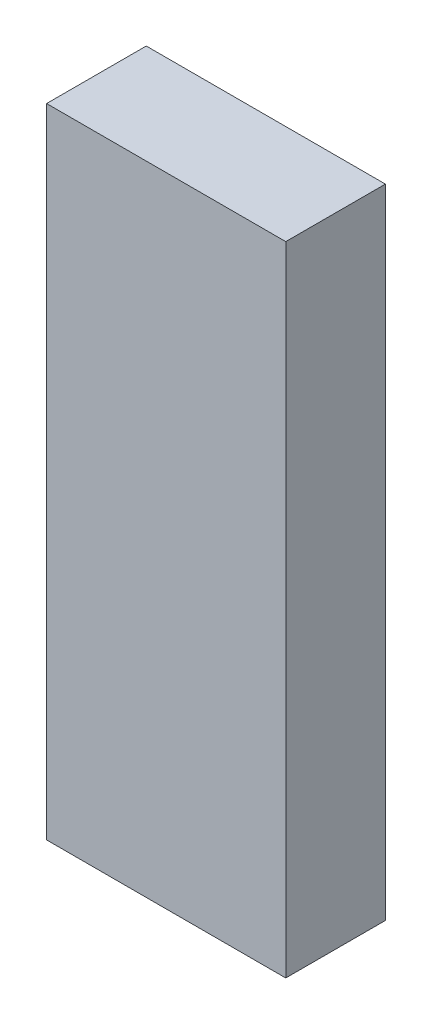
ISO-10303-21;
HEADER;
FILE_DESCRIPTION(('STEP AP214'),'2;1');
FILE_NAME('part.step','',(''),(''),'','','');
FILE_SCHEMA(('AUTOMOTIVE_DESIGN { 1 0 10303 214 1 1 1 1 }'));
ENDSEC;
DATA;
#1=APPLICATION_CONTEXT('core data for automotive mechanical design processes');
#2=APPLICATION_PROTOCOL_DEFINITION('international standard','automotive_design',2000,#1);
#3=PRODUCT_CONTEXT('',#1,'mechanical');
#4=PRODUCT('Part','Part','',(#3));
#5=PRODUCT_RELATED_PRODUCT_CATEGORY('part','',(#4));
#6=PRODUCT_DEFINITION_FORMATION('','',#4);
#7=PRODUCT_DEFINITION_CONTEXT('part definition',#1,'design');
#8=PRODUCT_DEFINITION('design','',#6,#7);
#9=PRODUCT_DEFINITION_SHAPE('','',#8);
#10=(LENGTH_UNIT() NAMED_UNIT(*) SI_UNIT(.MILLI.,.METRE.));
#11=(NAMED_UNIT(*) PLANE_ANGLE_UNIT() SI_UNIT($,.RADIAN.));
#12=(NAMED_UNIT(*) SI_UNIT($,.STERADIAN.) SOLID_ANGLE_UNIT());
#13=UNCERTAINTY_MEASURE_WITH_UNIT(LENGTH_MEASURE(1.E-05),#10,'distance_accuracy_value','');
#14=(GEOMETRIC_REPRESENTATION_CONTEXT(3) GLOBAL_UNCERTAINTY_ASSIGNED_CONTEXT((#13)) GLOBAL_UNIT_ASSIGNED_CONTEXT((#10,
#11,#12)) REPRESENTATION_CONTEXT('',''));
#15=CARTESIAN_POINT('',(0.,0.,0.));
#16=DIRECTION('',(0.,0.,1.));
#17=DIRECTION('',(1.,0.,0.));
#18=AXIS2_PLACEMENT_3D('',#15,#16,#17);
#19=CARTESIAN_POINT('',(9.525,25.4,7.9375));
#20=DIRECTION('',(-1.,0.,0.));
#21=DIRECTION('',(0.,-1.,0.));
#22=AXIS2_PLACEMENT_3D('',#19,#20,#21);
#23=PLANE('',#22);
#24=DIRECTION('',(0.,1.,0.));
#25=VECTOR('',#24,1.);
#26=CARTESIAN_POINT('',(9.525,25.4,0.));
#27=LINE('',#26,#25);
#28=CARTESIAN_POINT('',(9.525,-25.4,0.));
#29=VERTEX_POINT('',#28);
#30=CARTESIAN_POINT('',(9.525,25.4,0.));
#31=VERTEX_POINT('',#30);
#32=EDGE_CURVE('E113',#29,#31,#27,.T.);
#33=ORIENTED_EDGE('',*,*,#32,.T.);
#34=DIRECTION('',(0.,0.,-1.));
#35=VECTOR('',#34,1.);
#36=CARTESIAN_POINT('',(9.525,25.4,7.9375));
#37=LINE('',#36,#35);
#38=CARTESIAN_POINT('',(9.525,25.4,7.9375));
#39=VERTEX_POINT('',#38);
#40=EDGE_CURVE('E11',#39,#31,#37,.T.);
#41=ORIENTED_EDGE('',*,*,#40,.F.);
#42=DIRECTION('',(0.,1.,0.));
#43=VECTOR('',#42,1.);
#44=CARTESIAN_POINT('',(9.525,25.4,7.9375));
#45=LINE('',#44,#43);
#46=CARTESIAN_POINT('',(9.525,-25.4,7.9375));
#47=VERTEX_POINT('',#46);
#48=EDGE_CURVE('E97',#47,#39,#45,.T.);
#49=ORIENTED_EDGE('',*,*,#48,.F.);
#50=DIRECTION('',(0.,0.,-1.));
#51=VECTOR('',#50,1.);
#52=CARTESIAN_POINT('',(9.525,-25.4,7.9375));
#53=LINE('',#52,#51);
#54=EDGE_CURVE('E109',#47,#29,#53,.T.);
#55=ORIENTED_EDGE('',*,*,#54,.T.);
#56=EDGE_LOOP('',(#33,#41,#49,#55));
#57=FACE_BOUND('',#56,.T.);
#58=ADVANCED_FACE('F45',(#57),#23,.F.);
#59=CARTESIAN_POINT('',(-9.525,25.4,7.9375));
#60=DIRECTION('',(0.,-1.,0.));
#61=DIRECTION('',(0.,0.,-1.));
#62=AXIS2_PLACEMENT_3D('',#59,#60,#61);
#63=PLANE('',#62);
#64=DIRECTION('',(-1.,0.,0.));
#65=VECTOR('',#64,1.);
#66=CARTESIAN_POINT('',(-9.525,25.4,0.));
#67=LINE('',#66,#65);
#68=CARTESIAN_POINT('',(-9.525,25.4,0.));
#69=VERTEX_POINT('',#68);
#70=EDGE_CURVE('E102',#31,#69,#67,.T.);
#71=ORIENTED_EDGE('',*,*,#70,.T.);
#72=DIRECTION('',(0.,0.,-1.));
#73=VECTOR('',#72,1.);
#74=CARTESIAN_POINT('',(-9.525,25.4,7.9375));
#75=LINE('',#74,#73);
#76=CARTESIAN_POINT('',(-9.525,25.4,7.9375));
#77=VERTEX_POINT('',#76);
#78=EDGE_CURVE('E54',#77,#69,#75,.T.);
#79=ORIENTED_EDGE('',*,*,#78,.F.);
#80=DIRECTION('',(-1.,0.,0.));
#81=VECTOR('',#80,1.);
#82=CARTESIAN_POINT('',(-9.525,25.4,7.9375));
#83=LINE('',#82,#81);
#84=EDGE_CURVE('E92',#39,#77,#83,.T.);
#85=ORIENTED_EDGE('',*,*,#84,.F.);
#86=ORIENTED_EDGE('',*,*,#40,.T.);
#87=EDGE_LOOP('',(#71,#79,#85,#86));
#88=FACE_BOUND('',#87,.T.);
#89=ADVANCED_FACE('F101',(#88),#63,.F.);
#90=CARTESIAN_POINT('',(-9.525,25.4,7.9375));
#91=DIRECTION('',(1.,0.,0.));
#92=DIRECTION('',(0.,1.,0.));
#93=AXIS2_PLACEMENT_3D('',#90,#91,#92);
#94=PLANE('',#93);
#95=DIRECTION('',(0.,-1.,0.));
#96=VECTOR('',#95,1.);
#97=CARTESIAN_POINT('',(-9.525,25.4,0.));
#98=LINE('',#97,#96);
#99=CARTESIAN_POINT('',(-9.525,-25.4,0.));
#100=VERTEX_POINT('',#99);
#101=EDGE_CURVE('E79',#69,#100,#98,.T.);
#102=ORIENTED_EDGE('',*,*,#101,.T.);
#103=DIRECTION('',(0.,0.,-1.));
#104=VECTOR('',#103,1.);
#105=CARTESIAN_POINT('',(-9.525,-25.4,7.9375));
#106=LINE('',#105,#104);
#107=CARTESIAN_POINT('',(-9.525,-25.4,7.9375));
#108=VERTEX_POINT('',#107);
#109=EDGE_CURVE('E104',#108,#100,#106,.T.);
#110=ORIENTED_EDGE('',*,*,#109,.F.);
#111=DIRECTION('',(0.,-1.,0.));
#112=VECTOR('',#111,1.);
#113=CARTESIAN_POINT('',(-9.525,25.4,7.9375));
#114=LINE('',#113,#112);
#115=EDGE_CURVE('E95',#77,#108,#114,.T.);
#116=ORIENTED_EDGE('',*,*,#115,.F.);
#117=ORIENTED_EDGE('',*,*,#78,.T.);
#118=EDGE_LOOP('',(#102,#110,#116,#117));
#119=FACE_BOUND('',#118,.T.);
#120=ADVANCED_FACE('F105',(#119),#94,.F.);
#121=CARTESIAN_POINT('',(-9.525,-25.4,7.9375));
#122=DIRECTION('',(0.,1.,0.));
#123=DIRECTION('',(0.,0.,1.));
#124=AXIS2_PLACEMENT_3D('',#121,#122,#123);
#125=PLANE('',#124);
#126=DIRECTION('',(1.,0.,0.));
#127=VECTOR('',#126,1.);
#128=CARTESIAN_POINT('',(-9.525,-25.4,0.));
#129=LINE('',#128,#127);
#130=EDGE_CURVE('E85',#100,#29,#129,.T.);
#131=ORIENTED_EDGE('',*,*,#130,.T.);
#132=ORIENTED_EDGE('',*,*,#54,.F.);
#133=DIRECTION('',(1.,0.,0.));
#134=VECTOR('',#133,1.);
#135=CARTESIAN_POINT('',(-9.525,-25.4,7.9375));
#136=LINE('',#135,#134);
#137=EDGE_CURVE('E62',#108,#47,#136,.T.);
#138=ORIENTED_EDGE('',*,*,#137,.F.);
#139=ORIENTED_EDGE('',*,*,#109,.T.);
#140=EDGE_LOOP('',(#131,#132,#138,#139));
#141=FACE_BOUND('',#140,.T.);
#142=ADVANCED_FACE('F126',(#141),#125,.F.);
#143=CARTESIAN_POINT('',(0.,0.,7.9375));
#144=DIRECTION('',(0.,0.,1.));
#145=DIRECTION('',(1.,0.,0.));
#146=AXIS2_PLACEMENT_3D('',#143,#144,#145);
#147=PLANE('',#146);
#148=ORIENTED_EDGE('',*,*,#48,.T.);
#149=ORIENTED_EDGE('',*,*,#84,.T.);
#150=ORIENTED_EDGE('',*,*,#115,.T.);
#151=ORIENTED_EDGE('',*,*,#137,.T.);
#152=EDGE_LOOP('',(#148,#149,#150,#151));
#153=FACE_BOUND('',#152,.T.);
#154=ADVANCED_FACE('F93',(#153),#147,.T.);
#155=CARTESIAN_POINT('',(0.,0.,0.));
#156=DIRECTION('',(0.,0.,1.));
#157=DIRECTION('',(1.,0.,0.));
#158=AXIS2_PLACEMENT_3D('',#155,#156,#157);
#159=PLANE('',#158);
#160=ORIENTED_EDGE('',*,*,#32,.F.);
#161=ORIENTED_EDGE('',*,*,#130,.F.);
#162=ORIENTED_EDGE('',*,*,#101,.F.);
#163=ORIENTED_EDGE('',*,*,#70,.F.);
#164=EDGE_LOOP('',(#160,#161,#162,#163));
#165=FACE_BOUND('',#164,.T.);
#166=ADVANCED_FACE('F129',(#165),#159,.F.);
#167=CLOSED_SHELL('',(#58,#89,#120,#142,#154,#166));
#168=MANIFOLD_SOLID_BREP('B2',#167);
#169=ADVANCED_BREP_SHAPE_REPRESENTATION('',(#18,#168),#14);
#170=SHAPE_DEFINITION_REPRESENTATION(#9,#169);
ENDSEC;
END-ISO-10303-21;
